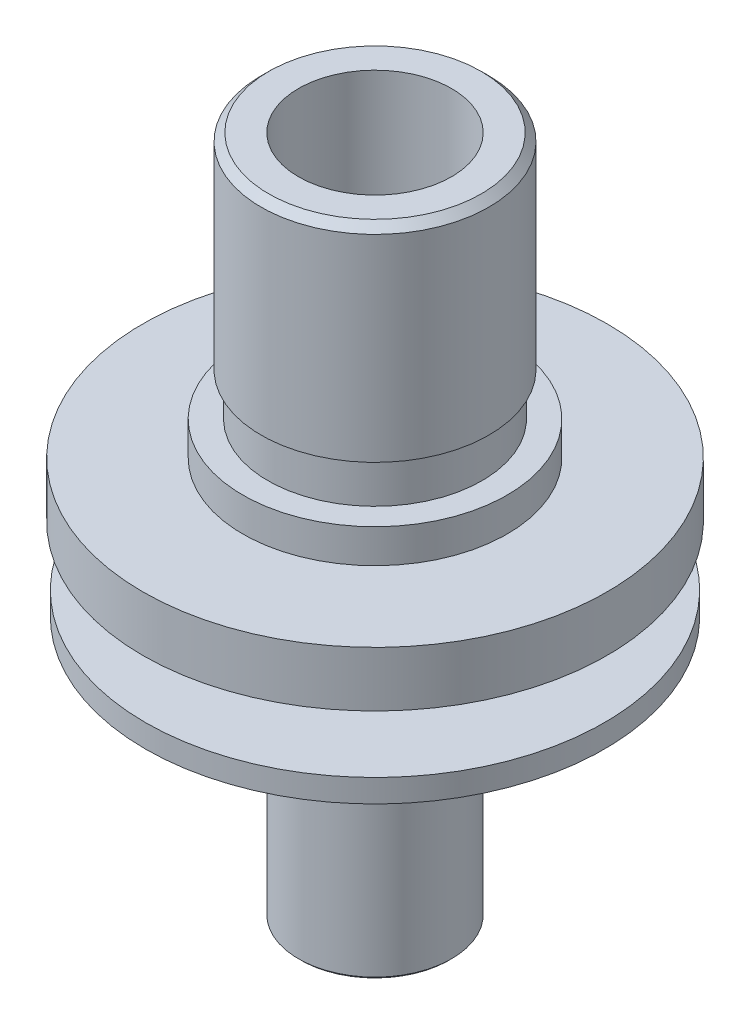
ISO-10303-21;
HEADER;
FILE_DESCRIPTION(('STEP AP214'),'2;1');
FILE_NAME('part.step','',(''),(''),'','','');
FILE_SCHEMA(('AUTOMOTIVE_DESIGN { 1 0 10303 214 1 1 1 1 }'));
ENDSEC;
DATA;
#1=APPLICATION_CONTEXT('core data for automotive mechanical design processes');
#2=APPLICATION_PROTOCOL_DEFINITION('international standard','automotive_design',2000,#1);
#3=PRODUCT_CONTEXT('',#1,'mechanical');
#4=PRODUCT('Part','Part','',(#3));
#5=PRODUCT_RELATED_PRODUCT_CATEGORY('part','',(#4));
#6=PRODUCT_DEFINITION_FORMATION('','',#4);
#7=PRODUCT_DEFINITION_CONTEXT('part definition',#1,'design');
#8=PRODUCT_DEFINITION('design','',#6,#7);
#9=PRODUCT_DEFINITION_SHAPE('','',#8);
#10=(LENGTH_UNIT() NAMED_UNIT(*) SI_UNIT(.MILLI.,.METRE.));
#11=(NAMED_UNIT(*) PLANE_ANGLE_UNIT() SI_UNIT($,.RADIAN.));
#12=(NAMED_UNIT(*) SI_UNIT($,.STERADIAN.) SOLID_ANGLE_UNIT());
#13=UNCERTAINTY_MEASURE_WITH_UNIT(LENGTH_MEASURE(1.E-05),#10,'distance_accuracy_value','');
#14=(GEOMETRIC_REPRESENTATION_CONTEXT(3) GLOBAL_UNCERTAINTY_ASSIGNED_CONTEXT((#13)) GLOBAL_UNIT_ASSIGNED_CONTEXT((#10,
#11,#12)) REPRESENTATION_CONTEXT('',''));
#15=CARTESIAN_POINT('',(0.,0.,0.));
#16=DIRECTION('',(0.,0.,1.));
#17=DIRECTION('',(1.,0.,0.));
#18=AXIS2_PLACEMENT_3D('',#15,#16,#17);
#19=CARTESIAN_POINT('',(0.,-12.319,47.625));
#20=DIRECTION('',(0.,-1.,0.));
#21=DIRECTION('',(0.,0.,-1.));
#22=AXIS2_PLACEMENT_3D('',#19,#20,#21);
#23=PLANE('',#22);
#24=CARTESIAN_POINT('',(0.,-12.319,0.));
#25=DIRECTION('',(0.,-1.,0.));
#26=DIRECTION('',(0.,0.,-1.));
#27=AXIS2_PLACEMENT_3D('',#24,#25,#26);
#28=CIRCLE('',#27,25.0825);
#29=CARTESIAN_POINT('',(0.,-12.319,-25.0825));
#30=VERTEX_POINT('',#29);
#31=EDGE_CURVE('E227',#30,#30,#28,.T.);
#32=ORIENTED_EDGE('',*,*,#31,.T.);
#33=EDGE_LOOP('',(#32));
#34=FACE_BOUND('',#33,.T.);
#35=CARTESIAN_POINT('',(0.,-12.319,0.));
#36=DIRECTION('',(0.,1.,0.));
#37=DIRECTION('',(0.,0.,1.));
#38=AXIS2_PLACEMENT_3D('',#35,#36,#37);
#39=CIRCLE('',#38,47.625);
#40=CARTESIAN_POINT('',(0.,-12.319,47.625));
#41=VERTEX_POINT('',#40);
#42=EDGE_CURVE('E341',#41,#41,#39,.T.);
#43=ORIENTED_EDGE('',*,*,#42,.T.);
#44=EDGE_LOOP('',(#43));
#45=FACE_BOUND('',#44,.T.);
#46=ADVANCED_FACE('F212',(#34,#45),#23,.F.);
#47=CARTESIAN_POINT('',(0.,0.,0.));
#48=DIRECTION('',(0.,1.,0.));
#49=DIRECTION('',(0.,0.,1.));
#50=AXIS2_PLACEMENT_3D('',#47,#48,#49);
#51=PLANE('',#50);
#52=CARTESIAN_POINT('',(0.,0.,0.));
#53=DIRECTION('',(0.,1.,0.));
#54=DIRECTION('',(0.,0.,1.));
#55=AXIS2_PLACEMENT_3D('',#52,#53,#54);
#56=CIRCLE('',#55,48.1624999999996);
#57=CARTESIAN_POINT('',(0.,0.,48.1624999999996));
#58=VERTEX_POINT('',#57);
#59=EDGE_CURVE('E329',#58,#58,#56,.F.);
#60=ORIENTED_EDGE('',*,*,#59,.T.);
#61=EDGE_LOOP('',(#60));
#62=FACE_BOUND('',#61,.T.);
#63=CARTESIAN_POINT('',(0.,0.,0.));
#64=DIRECTION('',(0.,-1.,0.));
#65=DIRECTION('',(0.,0.,-1.));
#66=AXIS2_PLACEMENT_3D('',#63,#64,#65);
#67=CIRCLE('',#66,25.0825);
#68=CARTESIAN_POINT('',(0.,0.,-25.0825));
#69=VERTEX_POINT('',#68);
#70=EDGE_CURVE('E236',#69,#69,#67,.T.);
#71=ORIENTED_EDGE('',*,*,#70,.F.);
#72=EDGE_LOOP('',(#71));
#73=FACE_BOUND('',#72,.T.);
#74=ADVANCED_FACE('F377',(#62,#73),#51,.F.);
#75=CARTESIAN_POINT('',(0.,0.,0.));
#76=DIRECTION('',(0.,-1.,0.));
#77=DIRECTION('',(0.,0.,-1.));
#78=AXIS2_PLACEMENT_3D('',#75,#76,#77);
#79=CYLINDRICAL_SURFACE('',#78,25.0825);
#80=ORIENTED_EDGE('',*,*,#31,.F.);
#81=EDGE_LOOP('',(#80));
#82=FACE_BOUND('',#81,.T.);
#83=ORIENTED_EDGE('',*,*,#70,.T.);
#84=EDGE_LOOP('',(#83));
#85=FACE_BOUND('',#84,.T.);
#86=ADVANCED_FACE('F214',(#82,#85),#79,.T.);
#87=CARTESIAN_POINT('',(0.,-136.224121395587,0.));
#88=DIRECTION('',(0.,1.,0.));
#89=DIRECTION('',(0.,0.,1.));
#90=AXIS2_PLACEMENT_3D('',#87,#88,#89);
#91=CYLINDRICAL_SURFACE('',#90,48.1624999999996);
#92=CARTESIAN_POINT('',(0.,11.43,0.));
#93=DIRECTION('',(0.,1.,0.));
#94=DIRECTION('',(0.,0.,1.));
#95=AXIS2_PLACEMENT_3D('',#92,#93,#94);
#96=CIRCLE('',#95,48.1624999999996);
#97=CARTESIAN_POINT('',(0.,11.43,48.1624999999996));
#98=VERTEX_POINT('',#97);
#99=EDGE_CURVE('E333',#98,#98,#96,.T.);
#100=ORIENTED_EDGE('',*,*,#99,.F.);
#101=EDGE_LOOP('',(#100));
#102=FACE_BOUND('',#101,.T.);
#103=ORIENTED_EDGE('',*,*,#59,.F.);
#104=EDGE_LOOP('',(#103));
#105=FACE_BOUND('',#104,.T.);
#106=ADVANCED_FACE('F388',(#102,#105),#91,.T.);
#107=CARTESIAN_POINT('',(0.,0.,0.));
#108=DIRECTION('',(0.,-1.,0.));
#109=DIRECTION('',(0.,0.,-1.));
#110=AXIS2_PLACEMENT_3D('',#107,#108,#109);
#111=CYLINDRICAL_SURFACE('',#110,23.61946);
#112=CARTESIAN_POINT('',(0.,27.305,0.));
#113=DIRECTION('',(0.,-1.,0.));
#114=DIRECTION('',(0.,0.,-1.));
#115=AXIS2_PLACEMENT_3D('',#112,#113,#114);
#116=CIRCLE('',#115,23.61946);
#117=CARTESIAN_POINT('',(0.,27.305,-23.61946));
#118=VERTEX_POINT('',#117);
#119=EDGE_CURVE('E271',#118,#118,#116,.T.);
#120=ORIENTED_EDGE('',*,*,#119,.F.);
#121=EDGE_LOOP('',(#120));
#122=FACE_BOUND('',#121,.T.);
#123=CARTESIAN_POINT('',(0.,68.2625,0.));
#124=DIRECTION('',(0.,-1.,0.));
#125=DIRECTION('',(0.,0.,-1.));
#126=AXIS2_PLACEMENT_3D('',#123,#124,#125);
#127=CIRCLE('',#126,23.61946);
#128=CARTESIAN_POINT('',(0.,68.2625,-23.61946));
#129=VERTEX_POINT('',#128);
#130=EDGE_CURVE('E275',#129,#129,#127,.T.);
#131=ORIENTED_EDGE('',*,*,#130,.T.);
#132=EDGE_LOOP('',(#131));
#133=FACE_BOUND('',#132,.T.);
#134=ADVANCED_FACE('F394',(#122,#133),#111,.T.);
#135=CARTESIAN_POINT('',(0.,69.85,0.));
#136=DIRECTION('',(0.,-1.,0.));
#137=DIRECTION('',(0.,0.,-1.));
#138=AXIS2_PLACEMENT_3D('',#135,#136,#137);
#139=CONICAL_SURFACE('',#138,22.03196,0.785398163397454);
#140=ORIENTED_EDGE('',*,*,#130,.F.);
#141=EDGE_LOOP('',(#140));
#142=FACE_BOUND('',#141,.T.);
#143=CARTESIAN_POINT('',(0.,69.85,0.));
#144=DIRECTION('',(0.,-1.,0.));
#145=DIRECTION('',(0.,0.,-1.));
#146=AXIS2_PLACEMENT_3D('',#143,#144,#145);
#147=CIRCLE('',#146,22.03196);
#148=CARTESIAN_POINT('',(0.,69.85,-22.03196));
#149=VERTEX_POINT('',#148);
#150=EDGE_CURVE('E279',#149,#149,#147,.T.);
#151=ORIENTED_EDGE('',*,*,#150,.T.);
#152=EDGE_LOOP('',(#151));
#153=FACE_BOUND('',#152,.T.);
#154=ADVANCED_FACE('F402',(#142,#153),#139,.T.);
#155=CARTESIAN_POINT('',(0.,69.8500000000012,0.));
#156=DIRECTION('',(0.,-1.,0.));
#157=DIRECTION('',(0.,0.,-1.));
#158=AXIS2_PLACEMENT_3D('',#155,#156,#157);
#159=PLANE('',#158);
#160=CARTESIAN_POINT('',(0.,69.85,0.));
#161=DIRECTION('',(0.,1.,0.));
#162=DIRECTION('',(0.,0.,1.));
#163=AXIS2_PLACEMENT_3D('',#160,#161,#162);
#164=CIRCLE('',#163,15.875);
#165=CARTESIAN_POINT('',(0.,69.85,15.875));
#166=VERTEX_POINT('',#165);
#167=EDGE_CURVE('E283',#166,#166,#164,.T.);
#168=ORIENTED_EDGE('',*,*,#167,.F.);
#169=EDGE_LOOP('',(#168));
#170=FACE_BOUND('',#169,.T.);
#171=ORIENTED_EDGE('',*,*,#150,.F.);
#172=EDGE_LOOP('',(#171));
#173=FACE_BOUND('',#172,.T.);
#174=ADVANCED_FACE('F451',(#170,#173),#159,.F.);
#175=CARTESIAN_POINT('',(0.,0.,0.));
#176=DIRECTION('',(0.,1.,0.));
#177=DIRECTION('',(0.,0.,1.));
#178=AXIS2_PLACEMENT_3D('',#175,#176,#177);
#179=CYLINDRICAL_SURFACE('',#178,15.875);
#180=CARTESIAN_POINT('',(0.,11.43,0.));
#181=DIRECTION('',(0.,1.,0.));
#182=DIRECTION('',(0.,0.,1.));
#183=AXIS2_PLACEMENT_3D('',#180,#181,#182);
#184=CIRCLE('',#183,15.875);
#185=CARTESIAN_POINT('',(0.,11.43,15.875));
#186=VERTEX_POINT('',#185);
#187=EDGE_CURVE('E222',#186,#186,#184,.T.);
#188=ORIENTED_EDGE('',*,*,#187,.F.);
#189=EDGE_LOOP('',(#188));
#190=FACE_BOUND('',#189,.T.);
#191=ORIENTED_EDGE('',*,*,#167,.T.);
#192=EDGE_LOOP('',(#191));
#193=FACE_BOUND('',#192,.T.);
#194=ADVANCED_FACE('F448',(#190,#193),#179,.F.);
#195=CARTESIAN_POINT('',(0.,27.305,22.225));
#196=DIRECTION('',(0.,1.,0.));
#197=DIRECTION('',(0.,0.,1.));
#198=AXIS2_PLACEMENT_3D('',#195,#196,#197);
#199=PLANE('',#198);
#200=CARTESIAN_POINT('',(0.,27.305,0.));
#201=DIRECTION('',(0.,-1.,0.));
#202=DIRECTION('',(0.,0.,-1.));
#203=AXIS2_PLACEMENT_3D('',#200,#201,#202);
#204=CIRCLE('',#203,22.225);
#205=CARTESIAN_POINT('',(0.,27.305,-22.225));
#206=VERTEX_POINT('',#205);
#207=EDGE_CURVE('E267',#206,#206,#204,.T.);
#208=ORIENTED_EDGE('',*,*,#207,.F.);
#209=EDGE_LOOP('',(#208));
#210=FACE_BOUND('',#209,.T.);
#211=ORIENTED_EDGE('',*,*,#119,.T.);
#212=EDGE_LOOP('',(#211));
#213=FACE_BOUND('',#212,.T.);
#214=ADVANCED_FACE('F450',(#210,#213),#199,.F.);
#215=CARTESIAN_POINT('',(0.,0.,0.));
#216=DIRECTION('',(0.,-1.,0.));
#217=DIRECTION('',(0.,0.,-1.));
#218=AXIS2_PLACEMENT_3D('',#215,#216,#217);
#219=CYLINDRICAL_SURFACE('',#218,22.225);
#220=CARTESIAN_POINT('',(0.,18.43,0.));
#221=DIRECTION('',(0.,-1.,0.));
#222=DIRECTION('',(0.,0.,-1.));
#223=AXIS2_PLACEMENT_3D('',#220,#221,#222);
#224=CIRCLE('',#223,22.225);
#225=CARTESIAN_POINT('',(0.,18.43,-22.225));
#226=VERTEX_POINT('',#225);
#227=EDGE_CURVE('E263',#226,#226,#224,.T.);
#228=ORIENTED_EDGE('',*,*,#227,.F.);
#229=EDGE_LOOP('',(#228));
#230=FACE_BOUND('',#229,.T.);
#231=ORIENTED_EDGE('',*,*,#207,.T.);
#232=EDGE_LOOP('',(#231));
#233=FACE_BOUND('',#232,.T.);
#234=ADVANCED_FACE('F461',(#230,#233),#219,.T.);
#235=CARTESIAN_POINT('',(0.,18.43,27.4096));
#236=DIRECTION('',(0.,-1.,0.));
#237=DIRECTION('',(0.,0.,-1.));
#238=AXIS2_PLACEMENT_3D('',#235,#236,#237);
#239=PLANE('',#238);
#240=CARTESIAN_POINT('',(0.,18.43,0.));
#241=DIRECTION('',(0.,-1.,0.));
#242=DIRECTION('',(0.,0.,-1.));
#243=AXIS2_PLACEMENT_3D('',#240,#241,#242);
#244=CIRCLE('',#243,27.4096);
#245=CARTESIAN_POINT('',(0.,18.43,-27.4096));
#246=VERTEX_POINT('',#245);
#247=EDGE_CURVE('E259',#246,#246,#244,.T.);
#248=ORIENTED_EDGE('',*,*,#247,.F.);
#249=EDGE_LOOP('',(#248));
#250=FACE_BOUND('',#249,.T.);
#251=ORIENTED_EDGE('',*,*,#227,.T.);
#252=EDGE_LOOP('',(#251));
#253=FACE_BOUND('',#252,.T.);
#254=ADVANCED_FACE('F465',(#250,#253),#239,.F.);
#255=CARTESIAN_POINT('',(0.,0.,0.));
#256=DIRECTION('',(0.,-1.,0.));
#257=DIRECTION('',(0.,0.,-1.));
#258=AXIS2_PLACEMENT_3D('',#255,#256,#257);
#259=CYLINDRICAL_SURFACE('',#258,27.4096);
#260=CARTESIAN_POINT('',(0.,11.43,0.));
#261=DIRECTION('',(0.,-1.,0.));
#262=DIRECTION('',(0.,0.,-1.));
#263=AXIS2_PLACEMENT_3D('',#260,#261,#262);
#264=CIRCLE('',#263,27.4096);
#265=CARTESIAN_POINT('',(0.,11.43,-27.4096));
#266=VERTEX_POINT('',#265);
#267=EDGE_CURVE('E241',#266,#266,#264,.T.);
#268=ORIENTED_EDGE('',*,*,#267,.F.);
#269=EDGE_LOOP('',(#268));
#270=FACE_BOUND('',#269,.T.);
#271=ORIENTED_EDGE('',*,*,#247,.T.);
#272=EDGE_LOOP('',(#271));
#273=FACE_BOUND('',#272,.T.);
#274=ADVANCED_FACE('F469',(#270,#273),#259,.T.);
#275=CARTESIAN_POINT('',(0.,11.43,52.5));
#276=DIRECTION('',(0.,-1.,0.));
#277=DIRECTION('',(0.,0.,-1.));
#278=AXIS2_PLACEMENT_3D('',#275,#276,#277);
#279=PLANE('',#278);
#280=ORIENTED_EDGE('',*,*,#99,.T.);
#281=EDGE_LOOP('',(#280));
#282=FACE_BOUND('',#281,.T.);
#283=ORIENTED_EDGE('',*,*,#267,.T.);
#284=EDGE_LOOP('',(#283));
#285=FACE_BOUND('',#284,.T.);
#286=ADVANCED_FACE('F473',(#282,#285),#279,.F.);
#287=CARTESIAN_POINT('',(0.,11.43,0.));
#288=DIRECTION('',(0.,1.,0.));
#289=DIRECTION('',(0.,0.,1.));
#290=AXIS2_PLACEMENT_3D('',#287,#288,#289);
#291=PLANE('',#290);
#292=ORIENTED_EDGE('',*,*,#187,.T.);
#293=EDGE_LOOP('',(#292));
#294=FACE_BOUND('',#293,.T.);
#295=ADVANCED_FACE('F351',(#294),#291,.T.);
#296=CARTESIAN_POINT('',(0.,-151.785341816037,0.));
#297=DIRECTION('',(0.,1.,0.));
#298=DIRECTION('',(0.,0.,1.));
#299=AXIS2_PLACEMENT_3D('',#296,#297,#298);
#300=CYLINDRICAL_SURFACE('',#299,47.625);
#301=ORIENTED_EDGE('',*,*,#42,.F.);
#302=EDGE_LOOP('',(#301));
#303=FACE_BOUND('',#302,.T.);
#304=CARTESIAN_POINT('',(0.,-17.0815,0.));
#305=DIRECTION('',(0.,1.,0.));
#306=DIRECTION('',(0.,0.,1.));
#307=AXIS2_PLACEMENT_3D('',#304,#305,#306);
#308=CIRCLE('',#307,47.625);
#309=CARTESIAN_POINT('',(0.,-17.0815,47.625));
#310=VERTEX_POINT('',#309);
#311=EDGE_CURVE('E337',#310,#310,#308,.F.);
#312=ORIENTED_EDGE('',*,*,#311,.F.);
#313=EDGE_LOOP('',(#312));
#314=FACE_BOUND('',#313,.T.);
#315=ADVANCED_FACE('F347',(#303,#314),#300,.T.);
#316=CARTESIAN_POINT('',(0.,-58.45048,9.525));
#317=DIRECTION('',(0.,-1.,0.));
#318=DIRECTION('',(0.,0.,-1.));
#319=AXIS2_PLACEMENT_3D('',#316,#317,#318);
#320=PLANE('',#319);
#321=CARTESIAN_POINT('',(0.,-58.45048,9.525));
#322=DIRECTION('',(0.,-1.,0.));
#323=DIRECTION('',(0.,0.,-1.));
#324=AXIS2_PLACEMENT_3D('',#321,#322,#323);
#325=CIRCLE('',#324,3.175);
#326=CARTESIAN_POINT('',(0.,-58.45048,6.35));
#327=VERTEX_POINT('',#326);
#328=EDGE_CURVE('E293',#327,#327,#325,.T.);
#329=ORIENTED_EDGE('',*,*,#328,.T.);
#330=EDGE_LOOP('',(#329));
#331=FACE_BOUND('',#330,.T.);
#332=ADVANCED_FACE('F350',(#331),#320,.T.);
#333=CARTESIAN_POINT('',(9.525,-58.45048,0.));
#334=DIRECTION('',(0.,-1.,0.));
#335=DIRECTION('',(-1.,0.,0.));
#336=AXIS2_PLACEMENT_3D('',#333,#334,#335);
#337=PLANE('',#336);
#338=CARTESIAN_POINT('',(9.525,-58.45048,0.));
#339=DIRECTION('',(0.,-1.,0.));
#340=DIRECTION('',(-1.,0.,0.));
#341=AXIS2_PLACEMENT_3D('',#338,#339,#340);
#342=CIRCLE('',#341,3.175);
#343=CARTESIAN_POINT('',(6.35,-58.45048,0.));
#344=VERTEX_POINT('',#343);
#345=EDGE_CURVE('E306',#344,#344,#342,.T.);
#346=ORIENTED_EDGE('',*,*,#345,.T.);
#347=EDGE_LOOP('',(#346));
#348=FACE_BOUND('',#347,.T.);
#349=ADVANCED_FACE('F417',(#348),#337,.T.);
#350=CARTESIAN_POINT('',(0.,-58.45048,-9.525));
#351=DIRECTION('',(0.,-1.,0.));
#352=DIRECTION('',(0.,0.,1.));
#353=AXIS2_PLACEMENT_3D('',#350,#351,#352);
#354=PLANE('',#353);
#355=CARTESIAN_POINT('',(0.,-58.45048,-9.525));
#356=DIRECTION('',(0.,-1.,0.));
#357=DIRECTION('',(0.,0.,1.));
#358=AXIS2_PLACEMENT_3D('',#355,#356,#357);
#359=CIRCLE('',#358,3.175);
#360=CARTESIAN_POINT('',(0.,-58.45048,-6.35));
#361=VERTEX_POINT('',#360);
#362=EDGE_CURVE('E315',#361,#361,#359,.T.);
#363=ORIENTED_EDGE('',*,*,#362,.T.);
#364=EDGE_LOOP('',(#363));
#365=FACE_BOUND('',#364,.T.);
#366=ADVANCED_FACE('F371',(#365),#354,.T.);
#367=CARTESIAN_POINT('',(-9.525,-58.45048,0.));
#368=DIRECTION('',(0.,-1.,0.));
#369=DIRECTION('',(1.,0.,0.));
#370=AXIS2_PLACEMENT_3D('',#367,#368,#369);
#371=PLANE('',#370);
#372=CARTESIAN_POINT('',(-9.525,-58.45048,0.));
#373=DIRECTION('',(0.,-1.,0.));
#374=DIRECTION('',(1.,0.,0.));
#375=AXIS2_PLACEMENT_3D('',#372,#373,#374);
#376=CIRCLE('',#375,3.175);
#377=CARTESIAN_POINT('',(-6.35,-58.45048,0.));
#378=VERTEX_POINT('',#377);
#379=EDGE_CURVE('E298',#378,#378,#376,.T.);
#380=ORIENTED_EDGE('',*,*,#379,.T.);
#381=EDGE_LOOP('',(#380));
#382=FACE_BOUND('',#381,.T.);
#383=ADVANCED_FACE('F365',(#382),#371,.T.);
#384=CARTESIAN_POINT('',(0.,0.,0.));
#385=DIRECTION('',(0.,-1.,0.));
#386=DIRECTION('',(0.,0.,-1.));
#387=AXIS2_PLACEMENT_3D('',#384,#385,#386);
#388=CYLINDRICAL_SURFACE('',#387,15.875);
#389=CARTESIAN_POINT('',(0.,-70.64248,0.));
#390=DIRECTION('',(0.,-1.,0.));
#391=DIRECTION('',(0.,0.,-1.));
#392=AXIS2_PLACEMENT_3D('',#389,#390,#391);
#393=CIRCLE('',#392,15.875);
#394=CARTESIAN_POINT('',(0.,-70.64248,-15.875));
#395=VERTEX_POINT('',#394);
#396=EDGE_CURVE('E249',#395,#395,#393,.T.);
#397=ORIENTED_EDGE('',*,*,#396,.F.);
#398=EDGE_LOOP('',(#397));
#399=FACE_BOUND('',#398,.T.);
#400=CARTESIAN_POINT('',(0.,-17.0815,0.));
#401=DIRECTION('',(0.,-1.,0.));
#402=DIRECTION('',(0.,0.,-1.));
#403=AXIS2_PLACEMENT_3D('',#400,#401,#402);
#404=CIRCLE('',#403,15.875);
#405=CARTESIAN_POINT('',(0.,-17.0815,-15.875));
#406=VERTEX_POINT('',#405);
#407=EDGE_CURVE('E245',#406,#406,#404,.T.);
#408=ORIENTED_EDGE('',*,*,#407,.T.);
#409=EDGE_LOOP('',(#408));
#410=FACE_BOUND('',#409,.T.);
#411=ADVANCED_FACE('F359',(#399,#410),#388,.T.);
#412=CARTESIAN_POINT('',(0.,-17.0815,25.0825));
#413=DIRECTION('',(0.,1.,0.));
#414=DIRECTION('',(0.,0.,1.));
#415=AXIS2_PLACEMENT_3D('',#412,#413,#414);
#416=PLANE('',#415);
#417=ORIENTED_EDGE('',*,*,#311,.T.);
#418=EDGE_LOOP('',(#417));
#419=FACE_BOUND('',#418,.T.);
#420=ORIENTED_EDGE('',*,*,#407,.F.);
#421=EDGE_LOOP('',(#420));
#422=FACE_BOUND('',#421,.T.);
#423=ADVANCED_FACE('F355',(#419,#422),#416,.F.);
#424=CARTESIAN_POINT('',(0.,-70.64248,0.));
#425=DIRECTION('',(0.,1.,0.));
#426=DIRECTION('',(0.,0.,1.));
#427=AXIS2_PLACEMENT_3D('',#424,#425,#426);
#428=CONICAL_SURFACE('',#427,15.875,0.78539816339745);
#429=CARTESIAN_POINT('',(0.,-71.15048,0.));
#430=DIRECTION('',(0.,-1.,0.));
#431=DIRECTION('',(0.,0.,-1.));
#432=AXIS2_PLACEMENT_3D('',#429,#430,#431);
#433=CIRCLE('',#432,15.367);
#434=CARTESIAN_POINT('',(0.,-71.15048,-15.367));
#435=VERTEX_POINT('',#434);
#436=EDGE_CURVE('E240',#435,#435,#433,.T.);
#437=ORIENTED_EDGE('',*,*,#436,.F.);
#438=EDGE_LOOP('',(#437));
#439=FACE_BOUND('',#438,.T.);
#440=ORIENTED_EDGE('',*,*,#396,.T.);
#441=EDGE_LOOP('',(#440));
#442=FACE_BOUND('',#441,.T.);
#443=ADVANCED_FACE('F358',(#439,#442),#428,.T.);
#444=CARTESIAN_POINT('',(0.,-58.45048,9.525));
#445=DIRECTION('',(0.,-1.,0.));
#446=DIRECTION('',(0.,0.,-1.));
#447=AXIS2_PLACEMENT_3D('',#444,#445,#446);
#448=CYLINDRICAL_SURFACE('',#447,3.175);
#449=ORIENTED_EDGE('',*,*,#328,.F.);
#450=EDGE_LOOP('',(#449));
#451=FACE_BOUND('',#450,.T.);
#452=CARTESIAN_POINT('',(0.,-71.15048,9.525));
#453=DIRECTION('',(0.,-1.,0.));
#454=DIRECTION('',(0.,0.,-1.));
#455=AXIS2_PLACEMENT_3D('',#452,#453,#454);
#456=CIRCLE('',#455,3.175);
#457=CARTESIAN_POINT('',(0.,-71.15048,6.35));
#458=VERTEX_POINT('',#457);
#459=EDGE_CURVE('E294',#458,#458,#456,.T.);
#460=ORIENTED_EDGE('',*,*,#459,.T.);
#461=EDGE_LOOP('',(#460));
#462=FACE_BOUND('',#461,.T.);
#463=ADVANCED_FACE('F428',(#451,#462),#448,.F.);
#464=CARTESIAN_POINT('',(9.525,-58.45048,0.));
#465=DIRECTION('',(0.,-1.,0.));
#466=DIRECTION('',(0.,0.,-1.));
#467=AXIS2_PLACEMENT_3D('',#464,#465,#466);
#468=CYLINDRICAL_SURFACE('',#467,3.175);
#469=ORIENTED_EDGE('',*,*,#345,.F.);
#470=EDGE_LOOP('',(#469));
#471=FACE_BOUND('',#470,.T.);
#472=CARTESIAN_POINT('',(9.525,-71.15048,0.));
#473=DIRECTION('',(0.,-1.,0.));
#474=DIRECTION('',(-1.,0.,0.));
#475=AXIS2_PLACEMENT_3D('',#472,#473,#474);
#476=CIRCLE('',#475,3.175);
#477=CARTESIAN_POINT('',(6.35,-71.15048,0.));
#478=VERTEX_POINT('',#477);
#479=EDGE_CURVE('E302',#478,#478,#476,.T.);
#480=ORIENTED_EDGE('',*,*,#479,.T.);
#481=EDGE_LOOP('',(#480));
#482=FACE_BOUND('',#481,.T.);
#483=ADVANCED_FACE('F421',(#471,#482),#468,.F.);
#484=CARTESIAN_POINT('',(0.,-58.45048,-9.525));
#485=DIRECTION('',(0.,-1.,0.));
#486=DIRECTION('',(0.,0.,-1.));
#487=AXIS2_PLACEMENT_3D('',#484,#485,#486);
#488=CYLINDRICAL_SURFACE('',#487,3.175);
#489=ORIENTED_EDGE('',*,*,#362,.F.);
#490=EDGE_LOOP('',(#489));
#491=FACE_BOUND('',#490,.T.);
#492=CARTESIAN_POINT('',(0.,-71.15048,-9.525));
#493=DIRECTION('',(0.,-1.,0.));
#494=DIRECTION('',(0.,0.,1.));
#495=AXIS2_PLACEMENT_3D('',#492,#493,#494);
#496=CIRCLE('',#495,3.175);
#497=CARTESIAN_POINT('',(0.,-71.15048,-6.35));
#498=VERTEX_POINT('',#497);
#499=EDGE_CURVE('E311',#498,#498,#496,.T.);
#500=ORIENTED_EDGE('',*,*,#499,.T.);
#501=EDGE_LOOP('',(#500));
#502=FACE_BOUND('',#501,.T.);
#503=ADVANCED_FACE('F413',(#491,#502),#488,.F.);
#504=CARTESIAN_POINT('',(-9.525,-58.45048,0.));
#505=DIRECTION('',(0.,-1.,0.));
#506=DIRECTION('',(0.,0.,-1.));
#507=AXIS2_PLACEMENT_3D('',#504,#505,#506);
#508=CYLINDRICAL_SURFACE('',#507,3.175);
#509=ORIENTED_EDGE('',*,*,#379,.F.);
#510=EDGE_LOOP('',(#509));
#511=FACE_BOUND('',#510,.T.);
#512=CARTESIAN_POINT('',(-9.525,-71.15048,0.));
#513=DIRECTION('',(0.,-1.,0.));
#514=DIRECTION('',(1.,0.,0.));
#515=AXIS2_PLACEMENT_3D('',#512,#513,#514);
#516=CIRCLE('',#515,3.175);
#517=CARTESIAN_POINT('',(-6.35,-71.15048,0.));
#518=VERTEX_POINT('',#517);
#519=EDGE_CURVE('E319',#518,#518,#516,.T.);
#520=ORIENTED_EDGE('',*,*,#519,.T.);
#521=EDGE_LOOP('',(#520));
#522=FACE_BOUND('',#521,.T.);
#523=ADVANCED_FACE('F409',(#511,#522),#508,.F.);
#524=CARTESIAN_POINT('',(0.,-71.15048,0.));
#525=DIRECTION('',(0.,1.,0.));
#526=DIRECTION('',(0.,0.,1.));
#527=AXIS2_PLACEMENT_3D('',#524,#525,#526);
#528=PLANE('',#527);
#529=ORIENTED_EDGE('',*,*,#519,.F.);
#530=EDGE_LOOP('',(#529));
#531=FACE_BOUND('',#530,.T.);
#532=ORIENTED_EDGE('',*,*,#499,.F.);
#533=EDGE_LOOP('',(#532));
#534=FACE_BOUND('',#533,.T.);
#535=ORIENTED_EDGE('',*,*,#479,.F.);
#536=EDGE_LOOP('',(#535));
#537=FACE_BOUND('',#536,.T.);
#538=ORIENTED_EDGE('',*,*,#459,.F.);
#539=EDGE_LOOP('',(#538));
#540=FACE_BOUND('',#539,.T.);
#541=ORIENTED_EDGE('',*,*,#436,.T.);
#542=EDGE_LOOP('',(#541));
#543=FACE_BOUND('',#542,.T.);
#544=CARTESIAN_POINT('',(0.,-71.15048,0.));
#545=DIRECTION('',(0.,-1.,0.));
#546=DIRECTION('',(0.,0.,-1.));
#547=AXIS2_PLACEMENT_3D('',#544,#545,#546);
#548=CIRCLE('',#547,4.10209999999998);
#549=CARTESIAN_POINT('',(0.,-71.15048,-4.10209999999998));
#550=VERTEX_POINT('',#549);
#551=EDGE_CURVE('E235',#550,#550,#548,.T.);
#552=ORIENTED_EDGE('',*,*,#551,.F.);
#553=EDGE_LOOP('',(#552));
#554=FACE_BOUND('',#553,.T.);
#555=ADVANCED_FACE('F412',(#531,#534,#537,#540,#543,#554),#528,.F.);
#556=CARTESIAN_POINT('',(0.,-71.15048,0.));
#557=DIRECTION('',(0.,-1.,0.));
#558=DIRECTION('',(0.,0.,-1.));
#559=AXIS2_PLACEMENT_3D('',#556,#557,#558);
#560=CYLINDRICAL_SURFACE('',#559,4.10209999999997);
#561=ORIENTED_EDGE('',*,*,#551,.T.);
#562=EDGE_LOOP('',(#561));
#563=FACE_BOUND('',#562,.T.);
#564=CARTESIAN_POINT('',(0.,-17.0815,0.));
#565=DIRECTION('',(0.,1.,0.));
#566=DIRECTION('',(0.,0.,1.));
#567=AXIS2_PLACEMENT_3D('',#564,#565,#566);
#568=CIRCLE('',#567,4.10209999999997);
#569=CARTESIAN_POINT('',(0.,-17.0815,4.10209999999997));
#570=VERTEX_POINT('',#569);
#571=EDGE_CURVE('E11',#570,#570,#568,.F.);
#572=ORIENTED_EDGE('',*,*,#571,.F.);
#573=EDGE_LOOP('',(#572));
#574=FACE_BOUND('',#573,.T.);
#575=ADVANCED_FACE('F442',(#563,#574),#560,.F.);
#576=ORIENTED_EDGE('',*,*,#571,.T.);
#577=EDGE_LOOP('',(#576));
#578=FACE_BOUND('',#577,.T.);
#579=ADVANCED_FACE('F361',(#578),#416,.F.);
#580=CLOSED_SHELL('',(#46,#74,#86,#106,#134,#154,#174,#194,#214,#234,#254,#274,#286,#295,#315,
#332,#349,#366,#383,#411,#423,#443,#463,#483,#503,#523,#555,#575,#579));
#581=CARTESIAN_POINT('',(0.,0.,0.));
#582=DIRECTION('',(0.,1.,0.));
#583=DIRECTION('',(0.,0.,1.));
#584=AXIS2_PLACEMENT_3D('',#581,#582,#583);
#585=CIRCLE('',#584,15.875);
#586=CARTESIAN_POINT('',(0.,0.,15.875));
#587=VERTEX_POINT('',#586);
#588=EDGE_CURVE('E307',#587,#587,#585,.T.);
#589=ORIENTED_EDGE('',*,*,#588,.F.);
#590=EDGE_LOOP('',(#589));
#591=FACE_BOUND('',#590,.T.);
#592=ADVANCED_FACE('F383',(#591),#51,.F.);
#593=CARTESIAN_POINT('',(0.,-9.52500000000002,0.));
#594=DIRECTION('',(0.,1.,0.));
#595=DIRECTION('',(0.,0.,1.));
#596=AXIS2_PLACEMENT_3D('',#593,#594,#595);
#597=CIRCLE('',#596,15.875);
#598=CARTESIAN_POINT('',(0.,-9.52500000000002,15.875));
#599=VERTEX_POINT('',#598);
#600=EDGE_CURVE('E234',#599,#599,#597,.T.);
#601=ORIENTED_EDGE('',*,*,#600,.F.);
#602=EDGE_LOOP('',(#601));
#603=FACE_BOUND('',#602,.T.);
#604=ORIENTED_EDGE('',*,*,#588,.T.);
#605=EDGE_LOOP('',(#604));
#606=FACE_BOUND('',#605,.T.);
#607=ADVANCED_FACE('F446',(#603,#606),#179,.F.);
#608=CARTESIAN_POINT('',(0.,-9.52500000000002,-15.875));
#609=DIRECTION('',(0.,1.,0.));
#610=DIRECTION('',(0.,0.,1.));
#611=AXIS2_PLACEMENT_3D('',#608,#609,#610);
#612=PLANE('',#611);
#613=CARTESIAN_POINT('',(0.,-9.52500000000002,0.));
#614=DIRECTION('',(0.,1.,0.));
#615=DIRECTION('',(0.,0.,1.));
#616=AXIS2_PLACEMENT_3D('',#613,#614,#615);
#617=CIRCLE('',#616,4.10209999999997);
#618=CARTESIAN_POINT('',(0.,-9.52500000000002,4.10209999999997));
#619=VERTEX_POINT('',#618);
#620=EDGE_CURVE('E230',#619,#619,#617,.T.);
#621=ORIENTED_EDGE('',*,*,#620,.F.);
#622=EDGE_LOOP('',(#621));
#623=FACE_BOUND('',#622,.T.);
#624=ORIENTED_EDGE('',*,*,#600,.T.);
#625=EDGE_LOOP('',(#624));
#626=FACE_BOUND('',#625,.T.);
#627=ADVANCED_FACE('F440',(#623,#626),#612,.T.);
#628=CARTESIAN_POINT('',(0.,-12.319,0.));
#629=DIRECTION('',(0.,1.,0.));
#630=DIRECTION('',(0.,0.,1.));
#631=AXIS2_PLACEMENT_3D('',#628,#629,#630);
#632=CIRCLE('',#631,4.10209999999997);
#633=CARTESIAN_POINT('',(0.,-12.319,4.10209999999997));
#634=VERTEX_POINT('',#633);
#635=EDGE_CURVE('E216',#634,#634,#632,.F.);
#636=ORIENTED_EDGE('',*,*,#635,.T.);
#637=EDGE_LOOP('',(#636));
#638=FACE_BOUND('',#637,.T.);
#639=ORIENTED_EDGE('',*,*,#620,.T.);
#640=EDGE_LOOP('',(#639));
#641=FACE_BOUND('',#640,.T.);
#642=ADVANCED_FACE('F436',(#638,#641),#560,.F.);
#643=CARTESIAN_POINT('',(0.,-12.319,0.));
#644=DIRECTION('',(0.,1.,0.));
#645=DIRECTION('',(0.,0.,1.));
#646=AXIS2_PLACEMENT_3D('',#643,#644,#645);
#647=PLANE('',#646);
#648=ORIENTED_EDGE('',*,*,#635,.F.);
#649=EDGE_LOOP('',(#648));
#650=FACE_BOUND('',#649,.T.);
#651=ADVANCED_FACE('F439',(#650),#647,.T.);
#652=CLOSED_SHELL('',(#592,#607,#627,#642,#651));
#653=ORIENTED_CLOSED_SHELL('',*,#652,.T.);
#654=BREP_WITH_VOIDS('B2',#580,(#653));
#655=ADVANCED_BREP_SHAPE_REPRESENTATION('',(#18,#654),#14);
#656=SHAPE_DEFINITION_REPRESENTATION(#9,#655);
ENDSEC;
END-ISO-10303-21;
